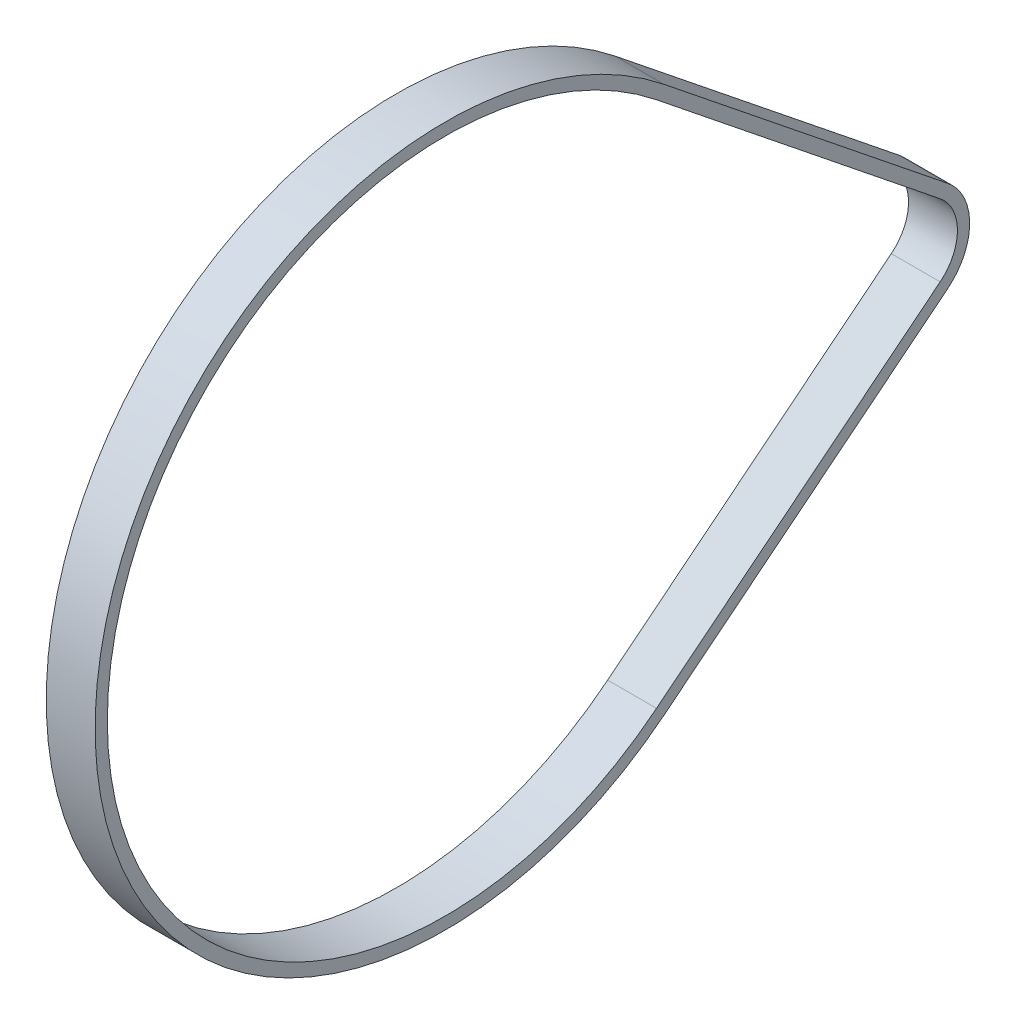
ISO-10303-21;
HEADER;
FILE_DESCRIPTION(('STEP AP214'),'2;1');
FILE_NAME('part.step','',(''),(''),'','','');
FILE_SCHEMA(('AUTOMOTIVE_DESIGN { 1 0 10303 214 1 1 1 1 }'));
ENDSEC;
DATA;
#1=APPLICATION_CONTEXT('core data for automotive mechanical design processes');
#2=APPLICATION_PROTOCOL_DEFINITION('international standard','automotive_design',2000,#1);
#3=PRODUCT_CONTEXT('',#1,'mechanical');
#4=PRODUCT('Part','Part','',(#3));
#5=PRODUCT_RELATED_PRODUCT_CATEGORY('part','',(#4));
#6=PRODUCT_DEFINITION_FORMATION('','',#4);
#7=PRODUCT_DEFINITION_CONTEXT('part definition',#1,'design');
#8=PRODUCT_DEFINITION('design','',#6,#7);
#9=PRODUCT_DEFINITION_SHAPE('','',#8);
#10=(LENGTH_UNIT() NAMED_UNIT(*) SI_UNIT(.MILLI.,.METRE.));
#11=(NAMED_UNIT(*) PLANE_ANGLE_UNIT() SI_UNIT($,.RADIAN.));
#12=(NAMED_UNIT(*) SI_UNIT($,.STERADIAN.) SOLID_ANGLE_UNIT());
#13=UNCERTAINTY_MEASURE_WITH_UNIT(LENGTH_MEASURE(1.E-05),#10,'distance_accuracy_value','');
#14=(GEOMETRIC_REPRESENTATION_CONTEXT(3) GLOBAL_UNCERTAINTY_ASSIGNED_CONTEXT((#13)) GLOBAL_UNIT_ASSIGNED_CONTEXT((#10,
#11,#12)) REPRESENTATION_CONTEXT('',''));
#15=CARTESIAN_POINT('',(0.,0.,0.));
#16=DIRECTION('',(0.,0.,1.));
#17=DIRECTION('',(1.,0.,0.));
#18=AXIS2_PLACEMENT_3D('',#15,#16,#17);
#19=CARTESIAN_POINT('',(5.,0.,47.6900209069988));
#20=DIRECTION('',(1.,0.,0.));
#21=DIRECTION('',(0.,0.,-1.));
#22=AXIS2_PLACEMENT_3D('',#19,#20,#21);
#23=PLANE('',#22);
#24=CARTESIAN_POINT('',(5.,0.,47.6900209069988));
#25=DIRECTION('',(1.,0.,0.));
#26=DIRECTION('',(0.,0.,-1.));
#27=AXIS2_PLACEMENT_3D('',#24,#25,#26);
#28=CIRCLE('',#27,71.6197243913529);
#29=CARTESIAN_POINT('',(5.,55.8656575746348,2.8746973485663));
#30=VERTEX_POINT('',#29);
#31=CARTESIAN_POINT('',(5.,-55.8656575746349,2.87469734856633));
#32=VERTEX_POINT('',#31);
#33=EDGE_CURVE('E137',#30,#32,#28,.T.);
#34=ORIENTED_EDGE('',*,*,#33,.T.);
#35=DIRECTION('',(0.,0.625739961152983,-0.78003173077527));
#36=VECTOR('',#35,1.);
#37=CARTESIAN_POINT('',(5.,-55.8656575746349,2.87469734856633));
#38=LINE('',#37,#36);
#39=CARTESIAN_POINT('',(5.,-9.31094292910583,-55.1592415000709));
#40=VERTEX_POINT('',#39);
#41=EDGE_CURVE('E140',#32,#40,#38,.T.);
#42=ORIENTED_EDGE('',*,*,#41,.T.);
#43=CARTESIAN_POINT('',(5.,0.,-47.6900209069988));
#44=DIRECTION('',(1.,0.,0.));
#45=DIRECTION('',(0.,0.,-1.));
#46=AXIS2_PLACEMENT_3D('',#43,#44,#45);
#47=CIRCLE('',#46,11.9366207318922);
#48=CARTESIAN_POINT('',(5.,9.3109429291058,-55.1592415000709));
#49=VERTEX_POINT('',#48);
#50=EDGE_CURVE('E143',#40,#49,#47,.T.);
#51=ORIENTED_EDGE('',*,*,#50,.T.);
#52=DIRECTION('',(0.,0.625739961152983,0.78003173077527));
#53=VECTOR('',#52,1.);
#54=CARTESIAN_POINT('',(5.,55.8656575746348,2.8746973485663));
#55=LINE('',#54,#53);
#56=EDGE_CURVE('E145',#49,#30,#55,.T.);
#57=ORIENTED_EDGE('',*,*,#56,.T.);
#58=EDGE_LOOP('',(#34,#42,#51,#57));
#59=FACE_BOUND('',#58,.T.);
#60=DIRECTION('',(0.,0.625739961152982,-0.78003173077527));
#61=VECTOR('',#60,1.);
#62=CARTESIAN_POINT('',(5.,-53.9155782476967,4.43904725144881));
#63=LINE('',#62,#61);
#64=CARTESIAN_POINT('',(5.,-53.9155782476967,4.43904725144881));
#65=VERTEX_POINT('',#64);
#66=CARTESIAN_POINT('',(5.,-7.36086360216766,-53.5948915971884));
#67=VERTEX_POINT('',#66);
#68=EDGE_CURVE('E109',#65,#67,#63,.T.);
#69=ORIENTED_EDGE('',*,*,#68,.F.);
#70=CARTESIAN_POINT('',(5.,0.,47.6900209069988));
#71=DIRECTION('',(1.,0.,0.));
#72=DIRECTION('',(0.,0.,-1.));
#73=AXIS2_PLACEMENT_3D('',#70,#71,#72);
#74=CIRCLE('',#73,69.1197243913529);
#75=CARTESIAN_POINT('',(5.,53.9155782476966,4.43904725144877));
#76=VERTEX_POINT('',#75);
#77=EDGE_CURVE('E101',#76,#65,#74,.T.);
#78=ORIENTED_EDGE('',*,*,#77,.F.);
#79=DIRECTION('',(0.,0.625739961152983,0.78003173077527));
#80=VECTOR('',#79,1.);
#81=CARTESIAN_POINT('',(5.,53.9155782476966,4.43904725144877));
#82=LINE('',#81,#80);
#83=CARTESIAN_POINT('',(5.,7.36086360216761,-53.5948915971885));
#84=VERTEX_POINT('',#83);
#85=EDGE_CURVE('E123',#84,#76,#82,.T.);
#86=ORIENTED_EDGE('',*,*,#85,.F.);
#87=CARTESIAN_POINT('',(5.,0.,-47.6900209069988));
#88=DIRECTION('',(1.,0.,0.));
#89=DIRECTION('',(0.,0.,-1.));
#90=AXIS2_PLACEMENT_3D('',#87,#88,#89);
#91=CIRCLE('',#90,9.43662073189215);
#92=EDGE_CURVE('E121',#67,#84,#91,.T.);
#93=ORIENTED_EDGE('',*,*,#92,.F.);
#94=EDGE_LOOP('',(#69,#78,#86,#93));
#95=FACE_BOUND('',#94,.T.);
#96=ADVANCED_FACE('F36',(#59,#95),#23,.T.);
#97=CARTESIAN_POINT('',(-5.,0.,47.6900209069988));
#98=DIRECTION('',(1.,0.,0.));
#99=DIRECTION('',(0.,0.,-1.));
#100=AXIS2_PLACEMENT_3D('',#97,#98,#99);
#101=PLANE('',#100);
#102=CARTESIAN_POINT('',(-5.,0.,47.6900209069988));
#103=DIRECTION('',(1.,0.,0.));
#104=DIRECTION('',(0.,0.,-1.));
#105=AXIS2_PLACEMENT_3D('',#102,#103,#104);
#106=CIRCLE('',#105,71.6197243913529);
#107=CARTESIAN_POINT('',(-5.,55.8656575746348,2.8746973485663));
#108=VERTEX_POINT('',#107);
#109=CARTESIAN_POINT('',(-5.,-55.8656575746349,2.87469734856633));
#110=VERTEX_POINT('',#109);
#111=EDGE_CURVE('E117',#108,#110,#106,.T.);
#112=ORIENTED_EDGE('',*,*,#111,.F.);
#113=DIRECTION('',(0.,0.625739961152983,0.78003173077527));
#114=VECTOR('',#113,1.);
#115=CARTESIAN_POINT('',(-5.,55.8656575746348,2.8746973485663));
#116=LINE('',#115,#114);
#117=CARTESIAN_POINT('',(-5.,9.3109429291058,-55.1592415000709));
#118=VERTEX_POINT('',#117);
#119=EDGE_CURVE('E141',#118,#108,#116,.T.);
#120=ORIENTED_EDGE('',*,*,#119,.F.);
#121=CARTESIAN_POINT('',(-5.,0.,-47.6900209069988));
#122=DIRECTION('',(1.,0.,0.));
#123=DIRECTION('',(0.,0.,-1.));
#124=AXIS2_PLACEMENT_3D('',#121,#122,#123);
#125=CIRCLE('',#124,11.9366207318922);
#126=CARTESIAN_POINT('',(-5.,-9.31094292910583,-55.1592415000709));
#127=VERTEX_POINT('',#126);
#128=EDGE_CURVE('E152',#127,#118,#125,.T.);
#129=ORIENTED_EDGE('',*,*,#128,.F.);
#130=DIRECTION('',(0.,0.625739961152983,-0.78003173077527));
#131=VECTOR('',#130,1.);
#132=CARTESIAN_POINT('',(-5.,-55.8656575746349,2.87469734856633));
#133=LINE('',#132,#131);
#134=EDGE_CURVE('E150',#110,#127,#133,.T.);
#135=ORIENTED_EDGE('',*,*,#134,.F.);
#136=EDGE_LOOP('',(#112,#120,#129,#135));
#137=FACE_BOUND('',#136,.T.);
#138=CARTESIAN_POINT('',(-5.,0.,47.6900209069988));
#139=DIRECTION('',(1.,0.,0.));
#140=DIRECTION('',(0.,0.,-1.));
#141=AXIS2_PLACEMENT_3D('',#138,#139,#140);
#142=CIRCLE('',#141,69.1197243913529);
#143=CARTESIAN_POINT('',(-5.,53.9155782476967,4.43904725144877));
#144=VERTEX_POINT('',#143);
#145=CARTESIAN_POINT('',(-5.,-53.9155782476967,4.43904725144881));
#146=VERTEX_POINT('',#145);
#147=EDGE_CURVE('E59',#144,#146,#142,.T.);
#148=ORIENTED_EDGE('',*,*,#147,.T.);
#149=DIRECTION('',(0.,0.625739961152982,-0.78003173077527));
#150=VECTOR('',#149,1.);
#151=CARTESIAN_POINT('',(-5.,-53.9155782476967,4.43904725144881));
#152=LINE('',#151,#150);
#153=CARTESIAN_POINT('',(-5.,-7.36086360216766,-53.5948915971884));
#154=VERTEX_POINT('',#153);
#155=EDGE_CURVE('E116',#146,#154,#152,.T.);
#156=ORIENTED_EDGE('',*,*,#155,.T.);
#157=CARTESIAN_POINT('',(-5.,0.,-47.6900209069988));
#158=DIRECTION('',(1.,0.,0.));
#159=DIRECTION('',(0.,0.,-1.));
#160=AXIS2_PLACEMENT_3D('',#157,#158,#159);
#161=CIRCLE('',#160,9.43662073189215);
#162=CARTESIAN_POINT('',(-5.,7.3608636021676,-53.5948915971885));
#163=VERTEX_POINT('',#162);
#164=EDGE_CURVE('E129',#154,#163,#161,.T.);
#165=ORIENTED_EDGE('',*,*,#164,.T.);
#166=DIRECTION('',(0.,0.625739961152983,0.78003173077527));
#167=VECTOR('',#166,1.);
#168=CARTESIAN_POINT('',(-5.,53.9155782476966,4.43904725144877));
#169=LINE('',#168,#167);
#170=EDGE_CURVE('E110',#163,#144,#169,.T.);
#171=ORIENTED_EDGE('',*,*,#170,.T.);
#172=EDGE_LOOP('',(#148,#156,#165,#171));
#173=FACE_BOUND('',#172,.T.);
#174=ADVANCED_FACE('F170',(#137,#173),#101,.F.);
#175=CARTESIAN_POINT('',(5.,0.,47.6900209069988));
#176=DIRECTION('',(-1.,0.,0.));
#177=DIRECTION('',(0.,0.,1.));
#178=AXIS2_PLACEMENT_3D('',#175,#176,#177);
#179=CYLINDRICAL_SURFACE('',#178,71.6197243913529);
#180=ORIENTED_EDGE('',*,*,#111,.T.);
#181=DIRECTION('',(-1.,0.,0.));
#182=VECTOR('',#181,1.);
#183=CARTESIAN_POINT('',(5.,-55.8656575746349,2.87469734856633));
#184=LINE('',#183,#182);
#185=EDGE_CURVE('E11',#32,#110,#184,.T.);
#186=ORIENTED_EDGE('',*,*,#185,.F.);
#187=ORIENTED_EDGE('',*,*,#33,.F.);
#188=DIRECTION('',(-1.,0.,0.));
#189=VECTOR('',#188,1.);
#190=CARTESIAN_POINT('',(5.,55.8656575746348,2.8746973485663));
#191=LINE('',#190,#189);
#192=EDGE_CURVE('E147',#30,#108,#191,.T.);
#193=ORIENTED_EDGE('',*,*,#192,.T.);
#194=EDGE_LOOP('',(#180,#186,#187,#193));
#195=FACE_BOUND('',#194,.T.);
#196=ADVANCED_FACE('F38',(#195),#179,.T.);
#197=CARTESIAN_POINT('',(5.,-55.8656575746349,2.87469734856633));
#198=DIRECTION('',(0.,0.78003173077527,0.625739961152983));
#199=DIRECTION('',(0.,-0.625739961152983,0.78003173077527));
#200=AXIS2_PLACEMENT_3D('',#197,#198,#199);
#201=PLANE('',#200);
#202=ORIENTED_EDGE('',*,*,#134,.T.);
#203=DIRECTION('',(-1.,0.,0.));
#204=VECTOR('',#203,1.);
#205=CARTESIAN_POINT('',(5.,-9.31094292910583,-55.1592415000709));
#206=LINE('',#205,#204);
#207=EDGE_CURVE('E44',#40,#127,#206,.T.);
#208=ORIENTED_EDGE('',*,*,#207,.F.);
#209=ORIENTED_EDGE('',*,*,#41,.F.);
#210=ORIENTED_EDGE('',*,*,#185,.T.);
#211=EDGE_LOOP('',(#202,#208,#209,#210));
#212=FACE_BOUND('',#211,.T.);
#213=ADVANCED_FACE('F180',(#212),#201,.F.);
#214=CARTESIAN_POINT('',(5.,0.,-47.6900209069988));
#215=DIRECTION('',(-1.,0.,0.));
#216=DIRECTION('',(0.,0.,1.));
#217=AXIS2_PLACEMENT_3D('',#214,#215,#216);
#218=CYLINDRICAL_SURFACE('',#217,11.9366207318922);
#219=ORIENTED_EDGE('',*,*,#128,.T.);
#220=DIRECTION('',(-1.,0.,0.));
#221=VECTOR('',#220,1.);
#222=CARTESIAN_POINT('',(5.,9.3109429291058,-55.1592415000709));
#223=LINE('',#222,#221);
#224=EDGE_CURVE('E157',#49,#118,#223,.T.);
#225=ORIENTED_EDGE('',*,*,#224,.F.);
#226=ORIENTED_EDGE('',*,*,#50,.F.);
#227=ORIENTED_EDGE('',*,*,#207,.T.);
#228=EDGE_LOOP('',(#219,#225,#226,#227));
#229=FACE_BOUND('',#228,.T.);
#230=ADVANCED_FACE('F164',(#229),#218,.T.);
#231=CARTESIAN_POINT('',(5.,55.8656575746348,2.8746973485663));
#232=DIRECTION('',(0.,-0.78003173077527,0.625739961152983));
#233=DIRECTION('',(0.,-0.625739961152983,-0.78003173077527));
#234=AXIS2_PLACEMENT_3D('',#231,#232,#233);
#235=PLANE('',#234);
#236=ORIENTED_EDGE('',*,*,#119,.T.);
#237=ORIENTED_EDGE('',*,*,#192,.F.);
#238=ORIENTED_EDGE('',*,*,#56,.F.);
#239=ORIENTED_EDGE('',*,*,#224,.T.);
#240=EDGE_LOOP('',(#236,#237,#238,#239));
#241=FACE_BOUND('',#240,.T.);
#242=ADVANCED_FACE('F174',(#241),#235,.F.);
#243=CARTESIAN_POINT('',(5.,0.,47.6900209069988));
#244=DIRECTION('',(-1.,0.,0.));
#245=DIRECTION('',(0.,0.,1.));
#246=AXIS2_PLACEMENT_3D('',#243,#244,#245);
#247=CYLINDRICAL_SURFACE('',#246,69.1197243913529);
#248=ORIENTED_EDGE('',*,*,#147,.F.);
#249=DIRECTION('',(-1.,0.,0.));
#250=VECTOR('',#249,1.);
#251=CARTESIAN_POINT('',(5.,53.9155782476966,4.43904725144877));
#252=LINE('',#251,#250);
#253=EDGE_CURVE('E105',#76,#144,#252,.T.);
#254=ORIENTED_EDGE('',*,*,#253,.F.);
#255=ORIENTED_EDGE('',*,*,#77,.T.);
#256=DIRECTION('',(-1.,0.,0.));
#257=VECTOR('',#256,1.);
#258=CARTESIAN_POINT('',(5.,-53.9155782476967,4.43904725144881));
#259=LINE('',#258,#257);
#260=EDGE_CURVE('E104',#65,#146,#259,.T.);
#261=ORIENTED_EDGE('',*,*,#260,.T.);
#262=EDGE_LOOP('',(#248,#254,#255,#261));
#263=FACE_BOUND('',#262,.T.);
#264=ADVANCED_FACE('F103',(#263),#247,.F.);
#265=CARTESIAN_POINT('',(5.,-53.9155782476967,4.43904725144881));
#266=DIRECTION('',(0.,0.78003173077527,0.625739961152982));
#267=DIRECTION('',(0.,-0.625739961152983,0.780031730775271));
#268=AXIS2_PLACEMENT_3D('',#265,#266,#267);
#269=PLANE('',#268);
#270=ORIENTED_EDGE('',*,*,#155,.F.);
#271=ORIENTED_EDGE('',*,*,#260,.F.);
#272=ORIENTED_EDGE('',*,*,#68,.T.);
#273=DIRECTION('',(-1.,0.,0.));
#274=VECTOR('',#273,1.);
#275=CARTESIAN_POINT('',(5.,-7.36086360216766,-53.5948915971884));
#276=LINE('',#275,#274);
#277=EDGE_CURVE('E118',#67,#154,#276,.T.);
#278=ORIENTED_EDGE('',*,*,#277,.T.);
#279=EDGE_LOOP('',(#270,#271,#272,#278));
#280=FACE_BOUND('',#279,.T.);
#281=ADVANCED_FACE('F113',(#280),#269,.T.);
#282=CARTESIAN_POINT('',(5.,0.,-47.6900209069988));
#283=DIRECTION('',(-1.,0.,0.));
#284=DIRECTION('',(0.,0.,1.));
#285=AXIS2_PLACEMENT_3D('',#282,#283,#284);
#286=CYLINDRICAL_SURFACE('',#285,9.43662073189215);
#287=ORIENTED_EDGE('',*,*,#164,.F.);
#288=ORIENTED_EDGE('',*,*,#277,.F.);
#289=ORIENTED_EDGE('',*,*,#92,.T.);
#290=DIRECTION('',(-1.,0.,0.));
#291=VECTOR('',#290,1.);
#292=CARTESIAN_POINT('',(5.,7.3608636021676,-53.5948915971885));
#293=LINE('',#292,#291);
#294=EDGE_CURVE('E51',#84,#163,#293,.T.);
#295=ORIENTED_EDGE('',*,*,#294,.T.);
#296=EDGE_LOOP('',(#287,#288,#289,#295));
#297=FACE_BOUND('',#296,.T.);
#298=ADVANCED_FACE('F203',(#297),#286,.F.);
#299=CARTESIAN_POINT('',(5.,53.9155782476966,4.43904725144877));
#300=DIRECTION('',(0.,-0.78003173077527,0.625739961152983));
#301=DIRECTION('',(0.,-0.625739961152983,-0.78003173077527));
#302=AXIS2_PLACEMENT_3D('',#299,#300,#301);
#303=PLANE('',#302);
#304=ORIENTED_EDGE('',*,*,#170,.F.);
#305=ORIENTED_EDGE('',*,*,#294,.F.);
#306=ORIENTED_EDGE('',*,*,#85,.T.);
#307=ORIENTED_EDGE('',*,*,#253,.T.);
#308=EDGE_LOOP('',(#304,#305,#306,#307));
#309=FACE_BOUND('',#308,.T.);
#310=ADVANCED_FACE('F207',(#309),#303,.T.);
#311=CLOSED_SHELL('',(#96,#174,#196,#213,#230,#242,#264,#281,#298,#310));
#312=MANIFOLD_SOLID_BREP('B2',#311);
#313=ADVANCED_BREP_SHAPE_REPRESENTATION('',(#18,#312),#14);
#314=SHAPE_DEFINITION_REPRESENTATION(#9,#313);
ENDSEC;
END-ISO-10303-21;
